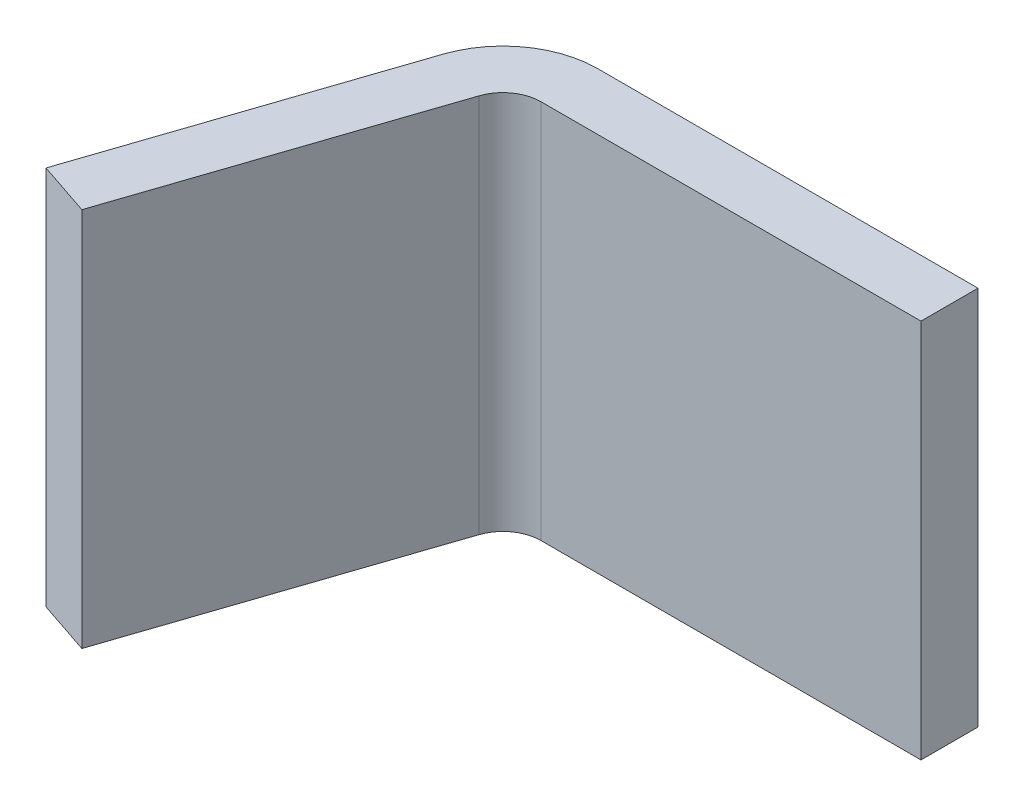
ISO-10303-21;
HEADER;
FILE_DESCRIPTION(('STEP AP214'),'2;1');
FILE_NAME('part.step','',(''),(''),'','','');
FILE_SCHEMA(('AUTOMOTIVE_DESIGN { 1 0 10303 214 1 1 1 1 }'));
ENDSEC;
DATA;
#1=APPLICATION_CONTEXT('core data for automotive mechanical design processes');
#2=APPLICATION_PROTOCOL_DEFINITION('international standard','automotive_design',2000,#1);
#3=PRODUCT_CONTEXT('',#1,'mechanical');
#4=PRODUCT('Part','Part','',(#3));
#5=PRODUCT_RELATED_PRODUCT_CATEGORY('part','',(#4));
#6=PRODUCT_DEFINITION_FORMATION('','',#4);
#7=PRODUCT_DEFINITION_CONTEXT('part definition',#1,'design');
#8=PRODUCT_DEFINITION('design','',#6,#7);
#9=PRODUCT_DEFINITION_SHAPE('','',#8);
#10=(LENGTH_UNIT() NAMED_UNIT(*) SI_UNIT(.MILLI.,.METRE.));
#11=(NAMED_UNIT(*) PLANE_ANGLE_UNIT() SI_UNIT($,.RADIAN.));
#12=(NAMED_UNIT(*) SI_UNIT($,.STERADIAN.) SOLID_ANGLE_UNIT());
#13=UNCERTAINTY_MEASURE_WITH_UNIT(LENGTH_MEASURE(1.E-05),#10,'distance_accuracy_value','');
#14=(GEOMETRIC_REPRESENTATION_CONTEXT(3) GLOBAL_UNCERTAINTY_ASSIGNED_CONTEXT((#13)) GLOBAL_UNIT_ASSIGNED_CONTEXT((#10,
#11,#12)) REPRESENTATION_CONTEXT('',''));
#15=CARTESIAN_POINT('',(0.,0.,0.));
#16=DIRECTION('',(0.,0.,1.));
#17=DIRECTION('',(1.,0.,0.));
#18=AXIS2_PLACEMENT_3D('',#15,#16,#17);
#19=CARTESIAN_POINT('',(-3.,-0.5,0.15));
#20=DIRECTION('',(0.,0.,1.));
#21=DIRECTION('',(1.,0.,0.));
#22=AXIS2_PLACEMENT_3D('',#19,#20,#21);
#23=PLANE('',#22);
#24=DIRECTION('',(0.,1.,0.));
#25=VECTOR('',#24,1.);
#26=CARTESIAN_POINT('',(-2.,-0.5,0.15));
#27=LINE('',#26,#25);
#28=CARTESIAN_POINT('',(-2.,-0.500000000000005,0.15));
#29=VERTEX_POINT('',#28);
#30=CARTESIAN_POINT('',(-2.,0.5,0.15));
#31=VERTEX_POINT('',#30);
#32=EDGE_CURVE('E101',#29,#31,#27,.T.);
#33=ORIENTED_EDGE('',*,*,#32,.T.);
#34=DIRECTION('',(1.,0.,0.));
#35=VECTOR('',#34,1.);
#36=CARTESIAN_POINT('',(-2.,0.5,0.15));
#37=LINE('',#36,#35);
#38=CARTESIAN_POINT('',(-3.,0.5,0.149999999999));
#39=VERTEX_POINT('',#38);
#40=EDGE_CURVE('E103',#31,#39,#37,.F.);
#41=ORIENTED_EDGE('',*,*,#40,.T.);
#42=DIRECTION('',(0.,-1.,0.));
#43=VECTOR('',#42,1.);
#44=CARTESIAN_POINT('',(-3.,-0.5,0.149999999998));
#45=LINE('',#44,#43);
#46=CARTESIAN_POINT('',(-3.,-0.5,0.149999999999));
#47=VERTEX_POINT('',#46);
#48=EDGE_CURVE('E169',#39,#47,#45,.T.);
#49=ORIENTED_EDGE('',*,*,#48,.T.);
#50=DIRECTION('',(-1.,0.,0.));
#51=VECTOR('',#50,1.);
#52=CARTESIAN_POINT('',(-3.,-0.5,0.15));
#53=LINE('',#52,#51);
#54=EDGE_CURVE('E105',#47,#29,#53,.F.);
#55=ORIENTED_EDGE('',*,*,#54,.T.);
#56=EDGE_LOOP('',(#33,#41,#49,#55));
#57=FACE_BOUND('',#56,.T.);
#58=ADVANCED_FACE('F17',(#57),#23,.T.);
#59=CARTESIAN_POINT('',(-3.,-0.5,0.249999999998));
#60=DIRECTION('',(0.,-1.,0.));
#61=DIRECTION('',(0.,0.,-1.));
#62=AXIS2_PLACEMENT_3D('',#59,#60,#61);
#63=CYLINDRICAL_SURFACE('',#62,0.1);
#64=DIRECTION('',(0.,1.,0.));
#65=VECTOR('',#64,1.);
#66=CARTESIAN_POINT('',(-3.09477990984,-0.5,0.218113189389));
#67=LINE('',#66,#65);
#68=CARTESIAN_POINT('',(-3.0947799098401,-0.499999999999999,0.21811318938931));
#69=VERTEX_POINT('',#68);
#70=CARTESIAN_POINT('',(-3.0947799098401,0.499999999999991,0.21811318938931));
#71=VERTEX_POINT('',#70);
#72=EDGE_CURVE('E56',#69,#71,#67,.T.);
#73=ORIENTED_EDGE('',*,*,#72,.F.);
#74=CARTESIAN_POINT('',(-3.,-0.5,0.249999999998));
#75=DIRECTION('',(0.,-1.,0.));
#76=DIRECTION('',(0.,0.,-1.));
#77=AXIS2_PLACEMENT_3D('',#74,#75,#76);
#78=CIRCLE('',#77,0.1);
#79=EDGE_CURVE('E20',#69,#47,#78,.T.);
#80=ORIENTED_EDGE('',*,*,#79,.T.);
#81=ORIENTED_EDGE('',*,*,#48,.F.);
#82=CARTESIAN_POINT('',(-3.,0.5,0.249999999998));
#83=DIRECTION('',(0.,-1.,0.));
#84=DIRECTION('',(0.,0.,-1.));
#85=AXIS2_PLACEMENT_3D('',#82,#83,#84);
#86=CIRCLE('',#85,0.1);
#87=EDGE_CURVE('E118',#39,#71,#86,.F.);
#88=ORIENTED_EDGE('',*,*,#87,.T.);
#89=EDGE_LOOP('',(#73,#80,#81,#88));
#90=FACE_BOUND('',#89,.T.);
#91=ADVANCED_FACE('F247',(#90),#63,.F.);
#92=CARTESIAN_POINT('',(-3.09477990984,-0.5,0.218113189389));
#93=DIRECTION('',(0.947799098397818,0.,0.318868106081939));
#94=DIRECTION('',(0.318868106081939,0.,-0.947799098397818));
#95=AXIS2_PLACEMENT_3D('',#92,#93,#94);
#96=PLANE('',#95);
#97=DIRECTION('',(0.318868106082316,0.,-0.947799098397691));
#98=VECTOR('',#97,1.);
#99=CARTESIAN_POINT('',(-3.357830135243,-0.499999999999994,1.));
#100=LINE('',#99,#98);
#101=CARTESIAN_POINT('',(-3.35783013524289,-0.499999999999996,0.999999999999835));
#102=VERTEX_POINT('',#101);
#103=EDGE_CURVE('E146',#102,#69,#100,.T.);
#104=ORIENTED_EDGE('',*,*,#103,.T.);
#105=ORIENTED_EDGE('',*,*,#72,.T.);
#106=DIRECTION('',(-0.318868106082316,0.,0.947799098397691));
#107=VECTOR('',#106,1.);
#108=CARTESIAN_POINT('',(-3.09477990984,0.499999999999982,0.218113189389));
#109=LINE('',#108,#107);
#110=CARTESIAN_POINT('',(-3.35783013524294,0.499999999999978,0.999999999999818));
#111=VERTEX_POINT('',#110);
#112=EDGE_CURVE('E162',#71,#111,#109,.T.);
#113=ORIENTED_EDGE('',*,*,#112,.T.);
#114=DIRECTION('',(0.,1.,0.));
#115=VECTOR('',#114,1.);
#116=CARTESIAN_POINT('',(-3.35783013524282,-0.5,0.999999999999454));
#117=LINE('',#116,#115);
#118=EDGE_CURVE('E67',#102,#111,#117,.T.);
#119=ORIENTED_EDGE('',*,*,#118,.F.);
#120=EDGE_LOOP('',(#104,#105,#113,#119));
#121=FACE_BOUND('',#120,.T.);
#122=ADVANCED_FACE('F200',(#121),#96,.T.);
#123=CARTESIAN_POINT('',(-3.5,-0.5,0.952169784088));
#124=DIRECTION('',(-0.318868106081939,0.,0.947799098397818));
#125=DIRECTION('',(0.947799098397818,0.,0.318868106081939));
#126=AXIS2_PLACEMENT_3D('',#123,#124,#125);
#127=PLANE('',#126);
#128=DIRECTION('',(0.947799098396593,0.,0.318868106085582));
#129=VECTOR('',#128,1.);
#130=CARTESIAN_POINT('',(-3.5,-0.499999999999992,0.952169784088));
#131=LINE('',#130,#129);
#132=CARTESIAN_POINT('',(-3.4999999999998,-0.499999999999995,0.952169784088069));
#133=VERTEX_POINT('',#132);
#134=EDGE_CURVE('E148',#133,#102,#131,.T.);
#135=ORIENTED_EDGE('',*,*,#134,.T.);
#136=ORIENTED_EDGE('',*,*,#118,.T.);
#137=DIRECTION('',(-0.947799098396593,0.,-0.318868106085582));
#138=VECTOR('',#137,1.);
#139=CARTESIAN_POINT('',(-3.357830135243,0.499999999999978,1.));
#140=LINE('',#139,#138);
#141=CARTESIAN_POINT('',(-3.4999999999998,0.499999999999976,0.952169784088069));
#142=VERTEX_POINT('',#141);
#143=EDGE_CURVE('E159',#111,#142,#140,.T.);
#144=ORIENTED_EDGE('',*,*,#143,.T.);
#145=DIRECTION('',(0.,1.,0.));
#146=VECTOR('',#145,1.);
#147=CARTESIAN_POINT('',(-3.49999999999939,-0.5,0.952169784088207));
#148=LINE('',#147,#146);
#149=EDGE_CURVE('E91',#133,#142,#148,.T.);
#150=ORIENTED_EDGE('',*,*,#149,.F.);
#151=EDGE_LOOP('',(#135,#136,#144,#150));
#152=FACE_BOUND('',#151,.T.);
#153=ADVANCED_FACE('F192',(#152),#127,.T.);
#154=CARTESIAN_POINT('',(-3.236949774597,-0.5,0.170282973478));
#155=DIRECTION('',(-0.947799098397818,0.,-0.318868106081939));
#156=DIRECTION('',(-0.318868106081939,0.,0.947799098397818));
#157=AXIS2_PLACEMENT_3D('',#154,#155,#156);
#158=PLANE('',#157);
#159=DIRECTION('',(-0.318868106082683,0.,0.947799098397568));
#160=VECTOR('',#159,1.);
#161=CARTESIAN_POINT('',(-3.236949774597,-0.499999999999996,0.170282973478));
#162=LINE('',#161,#160);
#163=CARTESIAN_POINT('',(-3.23694977459725,-0.5,0.170282973477984));
#164=VERTEX_POINT('',#163);
#165=EDGE_CURVE('E81',#164,#133,#162,.T.);
#166=ORIENTED_EDGE('',*,*,#165,.T.);
#167=ORIENTED_EDGE('',*,*,#149,.T.);
#168=DIRECTION('',(0.318868106082683,0.,-0.947799098397568));
#169=VECTOR('',#168,1.);
#170=CARTESIAN_POINT('',(-3.5,0.499999999999976,0.952169784088));
#171=LINE('',#170,#169);
#172=CARTESIAN_POINT('',(-3.23694977459725,0.5,0.170282973477984));
#173=VERTEX_POINT('',#172);
#174=EDGE_CURVE('E89',#142,#173,#171,.T.);
#175=ORIENTED_EDGE('',*,*,#174,.T.);
#176=DIRECTION('',(0.,-1.,0.));
#177=VECTOR('',#176,1.);
#178=CARTESIAN_POINT('',(-3.23694977459746,-0.5,0.170282973477847));
#179=LINE('',#178,#177);
#180=EDGE_CURVE('E140',#164,#173,#179,.F.);
#181=ORIENTED_EDGE('',*,*,#180,.F.);
#182=EDGE_LOOP('',(#166,#167,#175,#181));
#183=FACE_BOUND('',#182,.T.);
#184=ADVANCED_FACE('F189',(#183),#158,.T.);
#185=CARTESIAN_POINT('',(-3.,-0.5,0.15));
#186=DIRECTION('',(0.,1.,0.));
#187=DIRECTION('',(-1.,0.,0.));
#188=AXIS2_PLACEMENT_3D('',#185,#186,#187);
#189=PLANE('',#188);
#190=DIRECTION('',(0.,0.,1.));
#191=VECTOR('',#190,1.);
#192=CARTESIAN_POINT('',(-2.,-0.5,0.15));
#193=LINE('',#192,#191);
#194=CARTESIAN_POINT('',(-2.,-0.5,0.));
#195=VERTEX_POINT('',#194);
#196=EDGE_CURVE('E110',#195,#29,#193,.T.);
#197=ORIENTED_EDGE('',*,*,#196,.T.);
#198=ORIENTED_EDGE('',*,*,#54,.F.);
#199=ORIENTED_EDGE('',*,*,#79,.F.);
#200=ORIENTED_EDGE('',*,*,#103,.F.);
#201=ORIENTED_EDGE('',*,*,#134,.F.);
#202=ORIENTED_EDGE('',*,*,#165,.F.);
#203=CARTESIAN_POINT('',(-3.,-0.5,0.249999999998));
#204=DIRECTION('',(0.,-1.,0.));
#205=DIRECTION('',(0.,0.,-1.));
#206=AXIS2_PLACEMENT_3D('',#203,#204,#205);
#207=CIRCLE('',#206,0.249999999998);
#208=CARTESIAN_POINT('',(-3.,-0.5,0.));
#209=VERTEX_POINT('',#208);
#210=EDGE_CURVE('E155',#209,#164,#207,.F.);
#211=ORIENTED_EDGE('',*,*,#210,.F.);
#212=DIRECTION('',(1.,0.,0.));
#213=VECTOR('',#212,1.);
#214=CARTESIAN_POINT('',(-3.,-0.5,0.));
#215=LINE('',#214,#213);
#216=EDGE_CURVE('E132',#209,#195,#215,.T.);
#217=ORIENTED_EDGE('',*,*,#216,.T.);
#218=EDGE_LOOP('',(#197,#198,#199,#200,#201,#202,#211,#217));
#219=FACE_BOUND('',#218,.T.);
#220=ADVANCED_FACE('F191',(#219),#189,.F.);
#221=CARTESIAN_POINT('',(-2.,-0.5,0.15));
#222=DIRECTION('',(-1.,0.,0.));
#223=DIRECTION('',(0.,0.,1.));
#224=AXIS2_PLACEMENT_3D('',#221,#222,#223);
#225=PLANE('',#224);
#226=DIRECTION('',(0.,0.,1.));
#227=VECTOR('',#226,1.);
#228=CARTESIAN_POINT('',(-2.,0.5,0.15));
#229=LINE('',#228,#227);
#230=CARTESIAN_POINT('',(-2.,0.5,0.));
#231=VERTEX_POINT('',#230);
#232=EDGE_CURVE('E109',#231,#31,#229,.T.);
#233=ORIENTED_EDGE('',*,*,#232,.T.);
#234=ORIENTED_EDGE('',*,*,#32,.F.);
#235=ORIENTED_EDGE('',*,*,#196,.F.);
#236=DIRECTION('',(0.,1.,0.));
#237=VECTOR('',#236,1.);
#238=CARTESIAN_POINT('',(-2.,-0.5,0.));
#239=LINE('',#238,#237);
#240=EDGE_CURVE('E123',#195,#231,#239,.T.);
#241=ORIENTED_EDGE('',*,*,#240,.T.);
#242=EDGE_LOOP('',(#233,#234,#235,#241));
#243=FACE_BOUND('',#242,.T.);
#244=ADVANCED_FACE('F121',(#243),#225,.F.);
#245=CARTESIAN_POINT('',(-2.,0.5,0.15));
#246=DIRECTION('',(0.,-1.,0.));
#247=DIRECTION('',(1.,0.,0.));
#248=AXIS2_PLACEMENT_3D('',#245,#246,#247);
#249=PLANE('',#248);
#250=CARTESIAN_POINT('',(-3.,0.5,0.249999999998));
#251=DIRECTION('',(0.,-1.,0.));
#252=DIRECTION('',(0.,0.,-1.));
#253=AXIS2_PLACEMENT_3D('',#250,#251,#252);
#254=CIRCLE('',#253,0.249999999998);
#255=CARTESIAN_POINT('',(-3.,0.5,0.));
#256=VERTEX_POINT('',#255);
#257=EDGE_CURVE('E34',#173,#256,#254,.T.);
#258=ORIENTED_EDGE('',*,*,#257,.F.);
#259=ORIENTED_EDGE('',*,*,#174,.F.);
#260=ORIENTED_EDGE('',*,*,#143,.F.);
#261=ORIENTED_EDGE('',*,*,#112,.F.);
#262=ORIENTED_EDGE('',*,*,#87,.F.);
#263=ORIENTED_EDGE('',*,*,#40,.F.);
#264=ORIENTED_EDGE('',*,*,#232,.F.);
#265=DIRECTION('',(1.,0.,0.));
#266=VECTOR('',#265,1.);
#267=CARTESIAN_POINT('',(-3.,0.5,0.));
#268=LINE('',#267,#266);
#269=EDGE_CURVE('E26',#231,#256,#268,.F.);
#270=ORIENTED_EDGE('',*,*,#269,.T.);
#271=EDGE_LOOP('',(#258,#259,#260,#261,#262,#263,#264,#270));
#272=FACE_BOUND('',#271,.T.);
#273=ADVANCED_FACE('F114',(#272),#249,.F.);
#274=CARTESIAN_POINT('',(-3.,-0.5,0.249999999998));
#275=DIRECTION('',(0.,-1.,0.));
#276=DIRECTION('',(0.,0.,-1.));
#277=AXIS2_PLACEMENT_3D('',#274,#275,#276);
#278=CYLINDRICAL_SURFACE('',#277,0.249999999998);
#279=ORIENTED_EDGE('',*,*,#210,.T.);
#280=ORIENTED_EDGE('',*,*,#180,.T.);
#281=ORIENTED_EDGE('',*,*,#257,.T.);
#282=DIRECTION('',(0.,1.,0.));
#283=VECTOR('',#282,1.);
#284=CARTESIAN_POINT('',(-3.,-0.5,0.));
#285=LINE('',#284,#283);
#286=EDGE_CURVE('E11',#256,#209,#285,.F.);
#287=ORIENTED_EDGE('',*,*,#286,.T.);
#288=EDGE_LOOP('',(#279,#280,#281,#287));
#289=FACE_BOUND('',#288,.T.);
#290=ADVANCED_FACE('F188',(#289),#278,.T.);
#291=CARTESIAN_POINT('',(-3.,-0.5,0.));
#292=DIRECTION('',(0.,0.,1.));
#293=DIRECTION('',(1.,0.,0.));
#294=AXIS2_PLACEMENT_3D('',#291,#292,#293);
#295=PLANE('',#294);
#296=ORIENTED_EDGE('',*,*,#269,.F.);
#297=ORIENTED_EDGE('',*,*,#240,.F.);
#298=ORIENTED_EDGE('',*,*,#216,.F.);
#299=ORIENTED_EDGE('',*,*,#286,.F.);
#300=EDGE_LOOP('',(#296,#297,#298,#299));
#301=FACE_BOUND('',#300,.T.);
#302=ADVANCED_FACE('F187',(#301),#295,.F.);
#303=CLOSED_SHELL('',(#58,#91,#122,#153,#184,#220,#244,#273,#290,#302));
#304=MANIFOLD_SOLID_BREP('B1',#303);
#305=ADVANCED_BREP_SHAPE_REPRESENTATION('',(#18,#304),#14);
#306=SHAPE_DEFINITION_REPRESENTATION(#9,#305);
ENDSEC;
END-ISO-10303-21;
